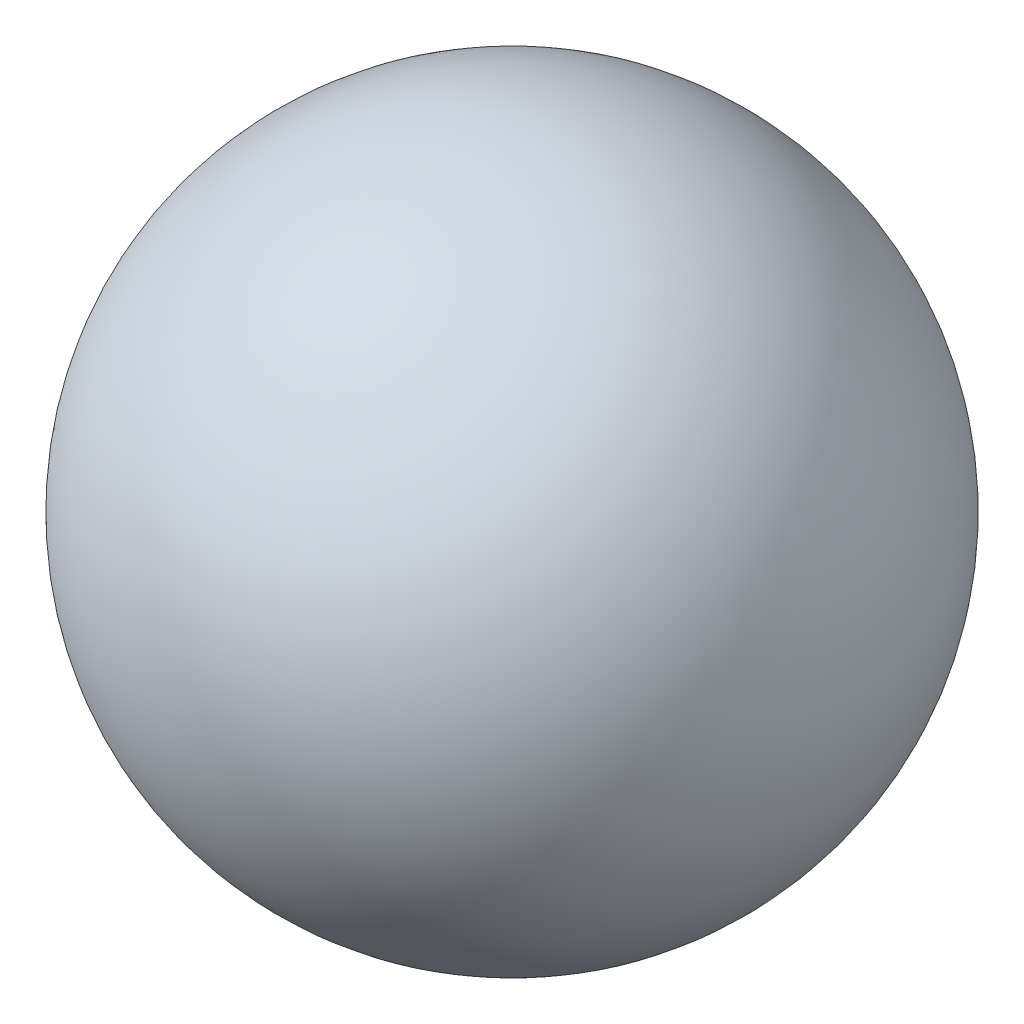
ISO-10303-21;
HEADER;
FILE_DESCRIPTION(('STEP AP214'),'2;1');
FILE_NAME('part.step','',(''),(''),'','','');
FILE_SCHEMA(('AUTOMOTIVE_DESIGN { 1 0 10303 214 1 1 1 1 }'));
ENDSEC;
DATA;
#1=APPLICATION_CONTEXT('core data for automotive mechanical design processes');
#2=APPLICATION_PROTOCOL_DEFINITION('international standard','automotive_design',2000,#1);
#3=PRODUCT_CONTEXT('',#1,'mechanical');
#4=PRODUCT('Part','Part','',(#3));
#5=PRODUCT_RELATED_PRODUCT_CATEGORY('part','',(#4));
#6=PRODUCT_DEFINITION_FORMATION('','',#4);
#7=PRODUCT_DEFINITION_CONTEXT('part definition',#1,'design');
#8=PRODUCT_DEFINITION('design','',#6,#7);
#9=PRODUCT_DEFINITION_SHAPE('','',#8);
#10=(LENGTH_UNIT() NAMED_UNIT(*) SI_UNIT(.MILLI.,.METRE.));
#11=(NAMED_UNIT(*) PLANE_ANGLE_UNIT() SI_UNIT($,.RADIAN.));
#12=(NAMED_UNIT(*) SI_UNIT($,.STERADIAN.) SOLID_ANGLE_UNIT());
#13=UNCERTAINTY_MEASURE_WITH_UNIT(LENGTH_MEASURE(1.E-05),#10,'distance_accuracy_value','');
#14=(GEOMETRIC_REPRESENTATION_CONTEXT(3) GLOBAL_UNCERTAINTY_ASSIGNED_CONTEXT((#13)) GLOBAL_UNIT_ASSIGNED_CONTEXT((#10,
#11,#12)) REPRESENTATION_CONTEXT('',''));
#15=CARTESIAN_POINT('',(0.,0.,0.));
#16=DIRECTION('',(0.,0.,1.));
#17=DIRECTION('',(1.,0.,0.));
#18=AXIS2_PLACEMENT_3D('',#15,#16,#17);
#19=CARTESIAN_POINT('',(0.,0.,0.));
#20=DIRECTION('',(0.,1.,0.));
#21=DIRECTION('',(1.,0.,0.));
#22=AXIS2_PLACEMENT_3D('',#19,#20,#21);
#23=SPHERICAL_SURFACE('',#22,31.5);
#24=CARTESIAN_POINT('',(0.,31.5,0.));
#25=VERTEX_POINT('',#24);
#26=VERTEX_LOOP('',#25);
#27=FACE_BOUND('',#26,.T.);
#28=ADVANCED_FACE('F32',(#27),#23,.T.);
#29=CLOSED_SHELL('',(#28));
#30=MANIFOLD_SOLID_BREP('B2',#29);
#31=ADVANCED_BREP_SHAPE_REPRESENTATION('',(#18,#30),#14);
#32=SHAPE_DEFINITION_REPRESENTATION(#9,#31);
ENDSEC;
END-ISO-10303-21;
